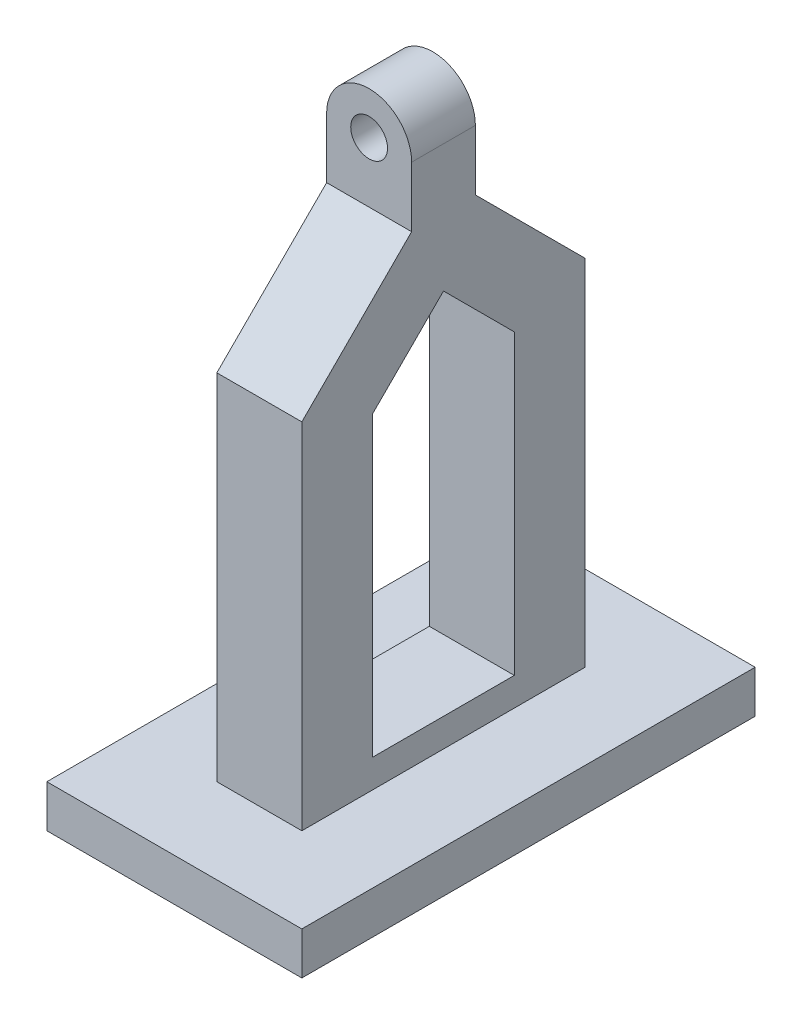
ISO-10303-21;
HEADER;
FILE_DESCRIPTION(('STEP AP214'),'2;1');
FILE_NAME('part.step','',(''),(''),'','','');
FILE_SCHEMA(('AUTOMOTIVE_DESIGN { 1 0 10303 214 1 1 1 1 }'));
ENDSEC;
DATA;
#1=APPLICATION_CONTEXT('core data for automotive mechanical design processes');
#2=APPLICATION_PROTOCOL_DEFINITION('international standard','automotive_design',2000,#1);
#3=PRODUCT_CONTEXT('',#1,'mechanical');
#4=PRODUCT('Part','Part','',(#3));
#5=PRODUCT_RELATED_PRODUCT_CATEGORY('part','',(#4));
#6=PRODUCT_DEFINITION_FORMATION('','',#4);
#7=PRODUCT_DEFINITION_CONTEXT('part definition',#1,'design');
#8=PRODUCT_DEFINITION('design','',#6,#7);
#9=PRODUCT_DEFINITION_SHAPE('','',#8);
#10=(LENGTH_UNIT() NAMED_UNIT(*) SI_UNIT(.MILLI.,.METRE.));
#11=(NAMED_UNIT(*) PLANE_ANGLE_UNIT() SI_UNIT($,.RADIAN.));
#12=(NAMED_UNIT(*) SI_UNIT($,.STERADIAN.) SOLID_ANGLE_UNIT());
#13=UNCERTAINTY_MEASURE_WITH_UNIT(LENGTH_MEASURE(1.E-05),#10,'distance_accuracy_value','');
#14=(GEOMETRIC_REPRESENTATION_CONTEXT(3) GLOBAL_UNCERTAINTY_ASSIGNED_CONTEXT((#13)) GLOBAL_UNIT_ASSIGNED_CONTEXT((#10,
#11,#12)) REPRESENTATION_CONTEXT('',''));
#15=CARTESIAN_POINT('',(0.,0.,0.));
#16=DIRECTION('',(0.,0.,1.));
#17=DIRECTION('',(1.,0.,0.));
#18=AXIS2_PLACEMENT_3D('',#15,#16,#17);
#19=CARTESIAN_POINT('',(0.,0.,2.8575));
#20=DIRECTION('',(0.,0.,-1.));
#21=DIRECTION('',(-1.,0.,0.));
#22=AXIS2_PLACEMENT_3D('',#19,#20,#21);
#23=PLANE('',#22);
#24=CARTESIAN_POINT('',(0.,50.8,2.8575));
#25=DIRECTION('',(0.,0.,-1.));
#26=DIRECTION('',(-1.,0.,0.));
#27=AXIS2_PLACEMENT_3D('',#24,#25,#26);
#28=CIRCLE('',#27,1.64999999999999);
#29=CARTESIAN_POINT('',(-1.64999999999999,50.8,2.8575));
#30=VERTEX_POINT('',#29);
#31=EDGE_CURVE('E179',#30,#30,#28,.T.);
#32=ORIENTED_EDGE('',*,*,#31,.T.);
#33=EDGE_LOOP('',(#32));
#34=FACE_BOUND('',#33,.T.);
#35=DIRECTION('',(0.,1.,0.));
#36=VECTOR('',#35,1.);
#37=CARTESIAN_POINT('',(3.81,48.26,2.8575));
#38=LINE('',#37,#36);
#39=CARTESIAN_POINT('',(3.81,45.4024999999999,2.8575));
#40=VERTEX_POINT('',#39);
#41=CARTESIAN_POINT('',(3.81,50.8,2.85750000000001));
#42=VERTEX_POINT('',#41);
#43=EDGE_CURVE('E201',#40,#42,#38,.T.);
#44=ORIENTED_EDGE('',*,*,#43,.T.);
#45=CARTESIAN_POINT('',(0.,50.8,2.85750000000001));
#46=DIRECTION('',(0.,0.,-1.));
#47=DIRECTION('',(-1.,0.,0.));
#48=AXIS2_PLACEMENT_3D('',#45,#46,#47);
#49=CIRCLE('',#48,3.81);
#50=CARTESIAN_POINT('',(-3.81,50.8,2.85750000000001));
#51=VERTEX_POINT('',#50);
#52=EDGE_CURVE('E73',#42,#51,#49,.F.);
#53=ORIENTED_EDGE('',*,*,#52,.T.);
#54=DIRECTION('',(0.,-1.,0.));
#55=VECTOR('',#54,1.);
#56=CARTESIAN_POINT('',(-3.81,48.26,2.8575));
#57=LINE('',#56,#55);
#58=CARTESIAN_POINT('',(-3.81,45.4024999999999,2.8575));
#59=VERTEX_POINT('',#58);
#60=EDGE_CURVE('E185',#51,#59,#57,.T.);
#61=ORIENTED_EDGE('',*,*,#60,.T.);
#62=DIRECTION('',(-1.,0.,0.));
#63=VECTOR('',#62,1.);
#64=CARTESIAN_POINT('',(0.,45.4024999999999,2.8575));
#65=LINE('',#64,#63);
#66=EDGE_CURVE('E59',#59,#40,#65,.F.);
#67=ORIENTED_EDGE('',*,*,#66,.T.);
#68=EDGE_LOOP('',(#44,#53,#61,#67));
#69=FACE_BOUND('',#68,.T.);
#70=ADVANCED_FACE('F49',(#34,#69),#23,.F.);
#71=CARTESIAN_POINT('',(0.,0.,-2.8575));
#72=DIRECTION('',(0.,0.,-1.));
#73=DIRECTION('',(-1.,0.,0.));
#74=AXIS2_PLACEMENT_3D('',#71,#72,#73);
#75=PLANE('',#74);
#76=CARTESIAN_POINT('',(0.,50.8,-2.8575));
#77=DIRECTION('',(0.,0.,-1.));
#78=DIRECTION('',(-1.,0.,0.));
#79=AXIS2_PLACEMENT_3D('',#76,#77,#78);
#80=CIRCLE('',#79,1.64999999999999);
#81=CARTESIAN_POINT('',(-1.64999999999999,50.8,-2.8575));
#82=VERTEX_POINT('',#81);
#83=EDGE_CURVE('E195',#82,#82,#80,.T.);
#84=ORIENTED_EDGE('',*,*,#83,.F.);
#85=EDGE_LOOP('',(#84));
#86=FACE_BOUND('',#85,.T.);
#87=CARTESIAN_POINT('',(0.,50.8,-2.85750000000001));
#88=DIRECTION('',(0.,0.,-1.));
#89=DIRECTION('',(-1.,0.,0.));
#90=AXIS2_PLACEMENT_3D('',#87,#88,#89);
#91=CIRCLE('',#90,3.81);
#92=CARTESIAN_POINT('',(3.81,50.8,-2.85750000000001));
#93=VERTEX_POINT('',#92);
#94=CARTESIAN_POINT('',(-3.81,50.8,-2.85750000000001));
#95=VERTEX_POINT('',#94);
#96=EDGE_CURVE('E12',#93,#95,#91,.F.);
#97=ORIENTED_EDGE('',*,*,#96,.F.);
#98=DIRECTION('',(0.,1.,0.));
#99=VECTOR('',#98,1.);
#100=CARTESIAN_POINT('',(3.81,48.26,-2.8575));
#101=LINE('',#100,#99);
#102=CARTESIAN_POINT('',(3.81,45.4024999999998,-2.8575));
#103=VERTEX_POINT('',#102);
#104=EDGE_CURVE('E178',#103,#93,#101,.T.);
#105=ORIENTED_EDGE('',*,*,#104,.F.);
#106=DIRECTION('',(1.,0.,0.));
#107=VECTOR('',#106,1.);
#108=CARTESIAN_POINT('',(3.81,45.4024999999998,-2.8575));
#109=LINE('',#108,#107);
#110=CARTESIAN_POINT('',(-3.81,45.4024999999998,-2.8575));
#111=VERTEX_POINT('',#110);
#112=EDGE_CURVE('E174',#103,#111,#109,.F.);
#113=ORIENTED_EDGE('',*,*,#112,.T.);
#114=DIRECTION('',(0.,-1.,0.));
#115=VECTOR('',#114,1.);
#116=CARTESIAN_POINT('',(-3.81,48.26,-2.8575));
#117=LINE('',#116,#115);
#118=EDGE_CURVE('E170',#95,#111,#117,.T.);
#119=ORIENTED_EDGE('',*,*,#118,.F.);
#120=EDGE_LOOP('',(#97,#105,#113,#119));
#121=FACE_BOUND('',#120,.T.);
#122=ADVANCED_FACE('F172',(#86,#121),#75,.T.);
#123=CARTESIAN_POINT('',(3.81,48.26,-12.7));
#124=DIRECTION('',(0.,0.,1.));
#125=DIRECTION('',(0.,-1.,0.));
#126=AXIS2_PLACEMENT_3D('',#123,#124,#125);
#127=PLANE('',#126);
#128=DIRECTION('',(0.,1.,0.));
#129=VECTOR('',#128,1.);
#130=CARTESIAN_POINT('',(-3.81,48.26,-12.7));
#131=LINE('',#130,#129);
#132=CARTESIAN_POINT('',(-3.81,3.81,-12.7));
#133=VERTEX_POINT('',#132);
#134=CARTESIAN_POINT('',(-3.81,35.5599999999999,-12.7));
#135=VERTEX_POINT('',#134);
#136=EDGE_CURVE('E287',#133,#135,#131,.T.);
#137=ORIENTED_EDGE('',*,*,#136,.T.);
#138=DIRECTION('',(1.,0.,0.));
#139=VECTOR('',#138,1.);
#140=CARTESIAN_POINT('',(3.81,35.5599999999999,-12.7));
#141=LINE('',#140,#139);
#142=CARTESIAN_POINT('',(3.81,35.5599999999999,-12.7));
#143=VERTEX_POINT('',#142);
#144=EDGE_CURVE('E339',#135,#143,#141,.T.);
#145=ORIENTED_EDGE('',*,*,#144,.T.);
#146=DIRECTION('',(0.,1.,0.));
#147=VECTOR('',#146,1.);
#148=CARTESIAN_POINT('',(3.81,48.26,-12.7));
#149=LINE('',#148,#147);
#150=CARTESIAN_POINT('',(3.81,3.81,-12.7));
#151=VERTEX_POINT('',#150);
#152=EDGE_CURVE('E291',#151,#143,#149,.T.);
#153=ORIENTED_EDGE('',*,*,#152,.F.);
#154=DIRECTION('',(-1.,0.,0.));
#155=VECTOR('',#154,1.);
#156=CARTESIAN_POINT('',(3.81,3.81,-12.7));
#157=LINE('',#156,#155);
#158=EDGE_CURVE('E253',#151,#133,#157,.T.);
#159=ORIENTED_EDGE('',*,*,#158,.T.);
#160=EDGE_LOOP('',(#137,#145,#153,#159));
#161=FACE_BOUND('',#160,.T.);
#162=ADVANCED_FACE('F375',(#161),#127,.F.);
#163=CARTESIAN_POINT('',(3.81,48.26,12.7));
#164=DIRECTION('',(0.,0.,-1.));
#165=DIRECTION('',(0.,1.,0.));
#166=AXIS2_PLACEMENT_3D('',#163,#164,#165);
#167=PLANE('',#166);
#168=DIRECTION('',(0.,-1.,0.));
#169=VECTOR('',#168,1.);
#170=CARTESIAN_POINT('',(3.81,48.26,12.7));
#171=LINE('',#170,#169);
#172=CARTESIAN_POINT('',(3.81,35.5599999999998,12.7));
#173=VERTEX_POINT('',#172);
#174=CARTESIAN_POINT('',(3.81,3.81,12.7));
#175=VERTEX_POINT('',#174);
#176=EDGE_CURVE('E295',#173,#175,#171,.T.);
#177=ORIENTED_EDGE('',*,*,#176,.F.);
#178=DIRECTION('',(-1.,0.,0.));
#179=VECTOR('',#178,1.);
#180=CARTESIAN_POINT('',(3.81,35.5599999999998,12.7));
#181=LINE('',#180,#179);
#182=CARTESIAN_POINT('',(-3.81,35.5599999999998,12.7));
#183=VERTEX_POINT('',#182);
#184=EDGE_CURVE('E350',#173,#183,#181,.T.);
#185=ORIENTED_EDGE('',*,*,#184,.T.);
#186=DIRECTION('',(0.,-1.,0.));
#187=VECTOR('',#186,1.);
#188=CARTESIAN_POINT('',(-3.81,48.26,12.7));
#189=LINE('',#188,#187);
#190=CARTESIAN_POINT('',(-3.81,3.81,12.7));
#191=VERTEX_POINT('',#190);
#192=EDGE_CURVE('E296',#183,#191,#189,.T.);
#193=ORIENTED_EDGE('',*,*,#192,.T.);
#194=DIRECTION('',(1.,0.,0.));
#195=VECTOR('',#194,1.);
#196=CARTESIAN_POINT('',(3.81,3.81,12.7));
#197=LINE('',#196,#195);
#198=EDGE_CURVE('E249',#191,#175,#197,.T.);
#199=ORIENTED_EDGE('',*,*,#198,.T.);
#200=EDGE_LOOP('',(#177,#185,#193,#199));
#201=FACE_BOUND('',#200,.T.);
#202=ADVANCED_FACE('F366',(#201),#167,.F.);
#203=CARTESIAN_POINT('',(3.81,0.,0.));
#204=DIRECTION('',(1.,0.,0.));
#205=DIRECTION('',(0.,0.,-1.));
#206=AXIS2_PLACEMENT_3D('',#203,#204,#205);
#207=PLANE('',#206);
#208=DIRECTION('',(0.,0.,-1.));
#209=VECTOR('',#208,1.);
#210=CARTESIAN_POINT('',(3.81,50.8,134.210456389493));
#211=LINE('',#210,#209);
#212=EDGE_CURVE('E66',#42,#93,#211,.T.);
#213=ORIENTED_EDGE('',*,*,#212,.F.);
#214=ORIENTED_EDGE('',*,*,#43,.F.);
#215=DIRECTION('',(0.,0.707106781186551,-0.707106781186544));
#216=VECTOR('',#215,1.);
#217=CARTESIAN_POINT('',(3.81,24.1299999999997,24.13));
#218=LINE('',#217,#216);
#219=EDGE_CURVE('E343',#40,#173,#218,.F.);
#220=ORIENTED_EDGE('',*,*,#219,.T.);
#221=ORIENTED_EDGE('',*,*,#176,.T.);
#222=DIRECTION('',(0.,0.,1.));
#223=VECTOR('',#222,1.);
#224=CARTESIAN_POINT('',(3.81,3.81,0.));
#225=LINE('',#224,#223);
#226=EDGE_CURVE('E257',#151,#175,#225,.T.);
#227=ORIENTED_EDGE('',*,*,#226,.F.);
#228=ORIENTED_EDGE('',*,*,#152,.T.);
#229=DIRECTION('',(0.,-0.707106781186544,-0.707106781186551));
#230=VECTOR('',#229,1.);
#231=CARTESIAN_POINT('',(3.81,24.1300000000001,-24.1299999999999));
#232=LINE('',#231,#230);
#233=EDGE_CURVE('E346',#143,#103,#232,.F.);
#234=ORIENTED_EDGE('',*,*,#233,.T.);
#235=ORIENTED_EDGE('',*,*,#104,.T.);
#236=EDGE_LOOP('',(#213,#214,#220,#221,#227,#228,#234,#235));
#237=FACE_BOUND('',#236,.T.);
#238=DIRECTION('',(0.,0.,-1.));
#239=VECTOR('',#238,1.);
#240=CARTESIAN_POINT('',(3.81,6.35,6.35));
#241=LINE('',#240,#239);
#242=CARTESIAN_POINT('',(3.81,6.35,6.35));
#243=VERTEX_POINT('',#242);
#244=CARTESIAN_POINT('',(3.81,6.35,-6.35));
#245=VERTEX_POINT('',#244);
#246=EDGE_CURVE('E261',#243,#245,#241,.T.);
#247=ORIENTED_EDGE('',*,*,#246,.F.);
#248=DIRECTION('',(0.,-1.,0.));
#249=VECTOR('',#248,1.);
#250=CARTESIAN_POINT('',(3.81,39.37,6.35000000000001));
#251=LINE('',#250,#249);
#252=CARTESIAN_POINT('',(3.81,33.02,6.35000000000001));
#253=VERTEX_POINT('',#252);
#254=EDGE_CURVE('E267',#253,#243,#251,.T.);
#255=ORIENTED_EDGE('',*,*,#254,.F.);
#256=DIRECTION('',(0.,-0.707106781186551,0.707106781186544));
#257=VECTOR('',#256,1.);
#258=CARTESIAN_POINT('',(3.81,33.02,6.35000000000001));
#259=LINE('',#258,#257);
#260=CARTESIAN_POINT('',(3.81,39.37,0.));
#261=VERTEX_POINT('',#260);
#262=EDGE_CURVE('E315',#253,#261,#259,.F.);
#263=ORIENTED_EDGE('',*,*,#262,.T.);
#264=DIRECTION('',(0.,0.707106781186544,0.707106781186551));
#265=VECTOR('',#264,1.);
#266=CARTESIAN_POINT('',(3.81,39.37,0.));
#267=LINE('',#266,#265);
#268=CARTESIAN_POINT('',(3.81,33.02,-6.34999999999999));
#269=VERTEX_POINT('',#268);
#270=EDGE_CURVE('E321',#261,#269,#267,.F.);
#271=ORIENTED_EDGE('',*,*,#270,.T.);
#272=DIRECTION('',(0.,1.,0.));
#273=VECTOR('',#272,1.);
#274=CARTESIAN_POINT('',(3.81,6.35,-6.35));
#275=LINE('',#274,#273);
#276=EDGE_CURVE('E277',#245,#269,#275,.T.);
#277=ORIENTED_EDGE('',*,*,#276,.F.);
#278=EDGE_LOOP('',(#247,#255,#263,#271,#277));
#279=FACE_BOUND('',#278,.T.);
#280=ADVANCED_FACE('F362',(#237,#279),#207,.T.);
#281=CARTESIAN_POINT('',(-3.81,0.,0.));
#282=DIRECTION('',(1.,0.,0.));
#283=DIRECTION('',(0.,0.,-1.));
#284=AXIS2_PLACEMENT_3D('',#281,#282,#283);
#285=PLANE('',#284);
#286=DIRECTION('',(0.,1.,0.));
#287=VECTOR('',#286,1.);
#288=CARTESIAN_POINT('',(-3.81,6.35,-6.35));
#289=LINE('',#288,#287);
#290=CARTESIAN_POINT('',(-3.81,6.35,-6.35));
#291=VERTEX_POINT('',#290);
#292=CARTESIAN_POINT('',(-3.81,33.02,-6.34999999999999));
#293=VERTEX_POINT('',#292);
#294=EDGE_CURVE('E266',#291,#293,#289,.T.);
#295=ORIENTED_EDGE('',*,*,#294,.T.);
#296=DIRECTION('',(0.,-0.707106781186544,-0.707106781186551));
#297=VECTOR('',#296,1.);
#298=CARTESIAN_POINT('',(-3.81,19.6850000000002,-19.685));
#299=LINE('',#298,#297);
#300=CARTESIAN_POINT('',(-3.81,39.37,0.));
#301=VERTEX_POINT('',#300);
#302=EDGE_CURVE('E324',#293,#301,#299,.F.);
#303=ORIENTED_EDGE('',*,*,#302,.T.);
#304=DIRECTION('',(0.,0.707106781186551,-0.707106781186544));
#305=VECTOR('',#304,1.);
#306=CARTESIAN_POINT('',(-3.81,19.6849999999998,19.685));
#307=LINE('',#306,#305);
#308=CARTESIAN_POINT('',(-3.81,33.02,6.35000000000001));
#309=VERTEX_POINT('',#308);
#310=EDGE_CURVE('E318',#301,#309,#307,.F.);
#311=ORIENTED_EDGE('',*,*,#310,.T.);
#312=DIRECTION('',(0.,-1.,0.));
#313=VECTOR('',#312,1.);
#314=CARTESIAN_POINT('',(-3.81,39.37,6.35000000000001));
#315=LINE('',#314,#313);
#316=CARTESIAN_POINT('',(-3.81,6.35,6.35));
#317=VERTEX_POINT('',#316);
#318=EDGE_CURVE('E271',#309,#317,#315,.T.);
#319=ORIENTED_EDGE('',*,*,#318,.T.);
#320=DIRECTION('',(0.,0.,-1.));
#321=VECTOR('',#320,1.);
#322=CARTESIAN_POINT('',(-3.81,6.35,6.35));
#323=LINE('',#322,#321);
#324=EDGE_CURVE('E262',#317,#291,#323,.T.);
#325=ORIENTED_EDGE('',*,*,#324,.T.);
#326=EDGE_LOOP('',(#295,#303,#311,#319,#325));
#327=FACE_BOUND('',#326,.T.);
#328=ORIENTED_EDGE('',*,*,#60,.F.);
#329=DIRECTION('',(0.,0.,-1.));
#330=VECTOR('',#329,1.);
#331=CARTESIAN_POINT('',(-3.81,50.8,134.210456389493));
#332=LINE('',#331,#330);
#333=EDGE_CURVE('E182',#51,#95,#332,.T.);
#334=ORIENTED_EDGE('',*,*,#333,.T.);
#335=ORIENTED_EDGE('',*,*,#118,.T.);
#336=DIRECTION('',(0.,0.707106781186544,0.707106781186551));
#337=VECTOR('',#336,1.);
#338=CARTESIAN_POINT('',(-3.81,48.26,2.34187669256869E-13));
#339=LINE('',#338,#337);
#340=EDGE_CURVE('E336',#111,#135,#339,.F.);
#341=ORIENTED_EDGE('',*,*,#340,.T.);
#342=ORIENTED_EDGE('',*,*,#136,.F.);
#343=DIRECTION('',(0.,0.,1.));
#344=VECTOR('',#343,1.);
#345=CARTESIAN_POINT('',(-3.81,3.81,0.));
#346=LINE('',#345,#344);
#347=EDGE_CURVE('E299',#133,#191,#346,.T.);
#348=ORIENTED_EDGE('',*,*,#347,.T.);
#349=ORIENTED_EDGE('',*,*,#192,.F.);
#350=DIRECTION('',(0.,-0.707106781186551,0.707106781186544));
#351=VECTOR('',#350,1.);
#352=CARTESIAN_POINT('',(-3.81,35.5599999999998,12.7));
#353=LINE('',#352,#351);
#354=EDGE_CURVE('E327',#183,#59,#353,.F.);
#355=ORIENTED_EDGE('',*,*,#354,.T.);
#356=EDGE_LOOP('',(#328,#334,#335,#341,#342,#348,#349,#355));
#357=FACE_BOUND('',#356,.T.);
#358=ADVANCED_FACE('F183',(#327,#357),#285,.F.);
#359=CARTESIAN_POINT('',(-3.81,6.35,6.35));
#360=DIRECTION('',(0.,-1.,0.));
#361=DIRECTION('',(0.,0.,-1.));
#362=AXIS2_PLACEMENT_3D('',#359,#360,#361);
#363=PLANE('',#362);
#364=ORIENTED_EDGE('',*,*,#246,.T.);
#365=DIRECTION('',(1.,0.,0.));
#366=VECTOR('',#365,1.);
#367=CARTESIAN_POINT('',(-3.81,6.35,-6.35));
#368=LINE('',#367,#366);
#369=EDGE_CURVE('E274',#291,#245,#368,.T.);
#370=ORIENTED_EDGE('',*,*,#369,.F.);
#371=ORIENTED_EDGE('',*,*,#324,.F.);
#372=DIRECTION('',(1.,0.,0.));
#373=VECTOR('',#372,1.);
#374=CARTESIAN_POINT('',(-3.81,6.35,6.35));
#375=LINE('',#374,#373);
#376=EDGE_CURVE('E283',#317,#243,#375,.T.);
#377=ORIENTED_EDGE('',*,*,#376,.T.);
#378=EDGE_LOOP('',(#364,#370,#371,#377));
#379=FACE_BOUND('',#378,.T.);
#380=ADVANCED_FACE('F424',(#379),#363,.F.);
#381=CARTESIAN_POINT('',(-3.81,39.37,6.35000000000001));
#382=DIRECTION('',(0.,0.,1.));
#383=DIRECTION('',(0.,-1.,0.));
#384=AXIS2_PLACEMENT_3D('',#381,#382,#383);
#385=PLANE('',#384);
#386=ORIENTED_EDGE('',*,*,#318,.F.);
#387=DIRECTION('',(1.,0.,0.));
#388=VECTOR('',#387,1.);
#389=CARTESIAN_POINT('',(3.81,33.02,6.35000000000001));
#390=LINE('',#389,#388);
#391=EDGE_CURVE('E308',#309,#253,#390,.T.);
#392=ORIENTED_EDGE('',*,*,#391,.T.);
#393=ORIENTED_EDGE('',*,*,#254,.T.);
#394=ORIENTED_EDGE('',*,*,#376,.F.);
#395=EDGE_LOOP('',(#386,#392,#393,#394));
#396=FACE_BOUND('',#395,.T.);
#397=ADVANCED_FACE('F421',(#396),#385,.F.);
#398=CARTESIAN_POINT('',(-3.81,6.35,-6.35));
#399=DIRECTION('',(0.,0.,-1.));
#400=DIRECTION('',(0.,1.,0.));
#401=AXIS2_PLACEMENT_3D('',#398,#399,#400);
#402=PLANE('',#401);
#403=ORIENTED_EDGE('',*,*,#276,.T.);
#404=DIRECTION('',(-1.,0.,0.));
#405=VECTOR('',#404,1.);
#406=CARTESIAN_POINT('',(-3.81,33.02,-6.34999999999999));
#407=LINE('',#406,#405);
#408=EDGE_CURVE('E312',#269,#293,#407,.T.);
#409=ORIENTED_EDGE('',*,*,#408,.T.);
#410=ORIENTED_EDGE('',*,*,#294,.F.);
#411=ORIENTED_EDGE('',*,*,#369,.T.);
#412=EDGE_LOOP('',(#403,#409,#410,#411));
#413=FACE_BOUND('',#412,.T.);
#414=ADVANCED_FACE('F419',(#413),#402,.F.);
#415=CARTESIAN_POINT('',(11.43,3.81,-20.32));
#416=DIRECTION('',(0.,0.,1.));
#417=DIRECTION('',(1.,0.,0.));
#418=AXIS2_PLACEMENT_3D('',#415,#416,#417);
#419=PLANE('',#418);
#420=DIRECTION('',(-1.,0.,0.));
#421=VECTOR('',#420,1.);
#422=CARTESIAN_POINT('',(11.43,0.,-20.32));
#423=LINE('',#422,#421);
#424=CARTESIAN_POINT('',(11.43,0.,-20.32));
#425=VERTEX_POINT('',#424);
#426=CARTESIAN_POINT('',(-11.43,0.,-20.32));
#427=VERTEX_POINT('',#426);
#428=EDGE_CURVE('E222',#425,#427,#423,.T.);
#429=ORIENTED_EDGE('',*,*,#428,.T.);
#430=DIRECTION('',(0.,-1.,0.));
#431=VECTOR('',#430,1.);
#432=CARTESIAN_POINT('',(-11.43,3.81,-20.32));
#433=LINE('',#432,#431);
#434=CARTESIAN_POINT('',(-11.43,3.81,-20.32));
#435=VERTEX_POINT('',#434);
#436=EDGE_CURVE('E245',#435,#427,#433,.T.);
#437=ORIENTED_EDGE('',*,*,#436,.F.);
#438=DIRECTION('',(-1.,0.,0.));
#439=VECTOR('',#438,1.);
#440=CARTESIAN_POINT('',(11.43,3.81,-20.32));
#441=LINE('',#440,#439);
#442=CARTESIAN_POINT('',(11.43,3.81,-20.32));
#443=VERTEX_POINT('',#442);
#444=EDGE_CURVE('E207',#443,#435,#441,.T.);
#445=ORIENTED_EDGE('',*,*,#444,.F.);
#446=DIRECTION('',(0.,-1.,0.));
#447=VECTOR('',#446,1.);
#448=CARTESIAN_POINT('',(11.43,3.81,-20.32));
#449=LINE('',#448,#447);
#450=EDGE_CURVE('E221',#443,#425,#449,.T.);
#451=ORIENTED_EDGE('',*,*,#450,.T.);
#452=EDGE_LOOP('',(#429,#437,#445,#451));
#453=FACE_BOUND('',#452,.T.);
#454=ADVANCED_FACE('F415',(#453),#419,.F.);
#455=CARTESIAN_POINT('',(-11.43,3.81,-20.32));
#456=DIRECTION('',(1.,0.,0.));
#457=DIRECTION('',(0.,0.,-1.));
#458=AXIS2_PLACEMENT_3D('',#455,#456,#457);
#459=PLANE('',#458);
#460=DIRECTION('',(0.,0.,1.));
#461=VECTOR('',#460,1.);
#462=CARTESIAN_POINT('',(-11.43,0.,-20.32));
#463=LINE('',#462,#461);
#464=CARTESIAN_POINT('',(-11.43,0.,20.32));
#465=VERTEX_POINT('',#464);
#466=EDGE_CURVE('E226',#427,#465,#463,.T.);
#467=ORIENTED_EDGE('',*,*,#466,.T.);
#468=DIRECTION('',(0.,-1.,0.));
#469=VECTOR('',#468,1.);
#470=CARTESIAN_POINT('',(-11.43,3.81,20.32));
#471=LINE('',#470,#469);
#472=CARTESIAN_POINT('',(-11.43,3.81,20.32));
#473=VERTEX_POINT('',#472);
#474=EDGE_CURVE('E241',#473,#465,#471,.T.);
#475=ORIENTED_EDGE('',*,*,#474,.F.);
#476=DIRECTION('',(0.,0.,1.));
#477=VECTOR('',#476,1.);
#478=CARTESIAN_POINT('',(-11.43,3.81,-20.32));
#479=LINE('',#478,#477);
#480=EDGE_CURVE('E211',#435,#473,#479,.T.);
#481=ORIENTED_EDGE('',*,*,#480,.F.);
#482=ORIENTED_EDGE('',*,*,#436,.T.);
#483=EDGE_LOOP('',(#467,#475,#481,#482));
#484=FACE_BOUND('',#483,.T.);
#485=ADVANCED_FACE('F411',(#484),#459,.F.);
#486=CARTESIAN_POINT('',(-11.43,3.81,20.32));
#487=DIRECTION('',(0.,0.,-1.));
#488=DIRECTION('',(-1.,0.,0.));
#489=AXIS2_PLACEMENT_3D('',#486,#487,#488);
#490=PLANE('',#489);
#491=DIRECTION('',(1.,0.,0.));
#492=VECTOR('',#491,1.);
#493=CARTESIAN_POINT('',(-11.43,0.,20.32));
#494=LINE('',#493,#492);
#495=CARTESIAN_POINT('',(11.43,0.,20.32));
#496=VERTEX_POINT('',#495);
#497=EDGE_CURVE('E229',#465,#496,#494,.T.);
#498=ORIENTED_EDGE('',*,*,#497,.T.);
#499=DIRECTION('',(0.,-1.,0.));
#500=VECTOR('',#499,1.);
#501=CARTESIAN_POINT('',(11.43,3.81,20.32));
#502=LINE('',#501,#500);
#503=CARTESIAN_POINT('',(11.43,3.81,20.32));
#504=VERTEX_POINT('',#503);
#505=EDGE_CURVE('E237',#504,#496,#502,.T.);
#506=ORIENTED_EDGE('',*,*,#505,.F.);
#507=DIRECTION('',(1.,0.,0.));
#508=VECTOR('',#507,1.);
#509=CARTESIAN_POINT('',(-11.43,3.81,20.32));
#510=LINE('',#509,#508);
#511=EDGE_CURVE('E215',#473,#504,#510,.T.);
#512=ORIENTED_EDGE('',*,*,#511,.F.);
#513=ORIENTED_EDGE('',*,*,#474,.T.);
#514=EDGE_LOOP('',(#498,#506,#512,#513));
#515=FACE_BOUND('',#514,.T.);
#516=ADVANCED_FACE('F407',(#515),#490,.F.);
#517=CARTESIAN_POINT('',(11.43,3.81,20.32));
#518=DIRECTION('',(-1.,0.,0.));
#519=DIRECTION('',(0.,0.,1.));
#520=AXIS2_PLACEMENT_3D('',#517,#518,#519);
#521=PLANE('',#520);
#522=DIRECTION('',(0.,0.,-1.));
#523=VECTOR('',#522,1.);
#524=CARTESIAN_POINT('',(11.43,0.,20.32));
#525=LINE('',#524,#523);
#526=EDGE_CURVE('E212',#496,#425,#525,.T.);
#527=ORIENTED_EDGE('',*,*,#526,.T.);
#528=ORIENTED_EDGE('',*,*,#450,.F.);
#529=DIRECTION('',(0.,0.,-1.));
#530=VECTOR('',#529,1.);
#531=CARTESIAN_POINT('',(11.43,3.81,20.32));
#532=LINE('',#531,#530);
#533=EDGE_CURVE('E218',#504,#443,#532,.T.);
#534=ORIENTED_EDGE('',*,*,#533,.F.);
#535=ORIENTED_EDGE('',*,*,#505,.T.);
#536=EDGE_LOOP('',(#527,#528,#534,#535));
#537=FACE_BOUND('',#536,.T.);
#538=ADVANCED_FACE('F404',(#537),#521,.F.);
#539=CARTESIAN_POINT('',(0.,3.81,0.));
#540=DIRECTION('',(0.,1.,0.));
#541=DIRECTION('',(0.,0.,1.));
#542=AXIS2_PLACEMENT_3D('',#539,#540,#541);
#543=PLANE('',#542);
#544=ORIENTED_EDGE('',*,*,#158,.F.);
#545=ORIENTED_EDGE('',*,*,#226,.T.);
#546=ORIENTED_EDGE('',*,*,#198,.F.);
#547=ORIENTED_EDGE('',*,*,#347,.F.);
#548=EDGE_LOOP('',(#544,#545,#546,#547));
#549=FACE_BOUND('',#548,.T.);
#550=ORIENTED_EDGE('',*,*,#444,.T.);
#551=ORIENTED_EDGE('',*,*,#480,.T.);
#552=ORIENTED_EDGE('',*,*,#511,.T.);
#553=ORIENTED_EDGE('',*,*,#533,.T.);
#554=EDGE_LOOP('',(#550,#551,#552,#553));
#555=FACE_BOUND('',#554,.T.);
#556=ADVANCED_FACE('F370',(#549,#555),#543,.T.);
#557=CARTESIAN_POINT('',(3.81,0.,12.7));
#558=DIRECTION('',(0.,1.,0.));
#559=DIRECTION('',(0.,0.,1.));
#560=AXIS2_PLACEMENT_3D('',#557,#558,#559);
#561=PLANE('',#560);
#562=ORIENTED_EDGE('',*,*,#428,.F.);
#563=ORIENTED_EDGE('',*,*,#526,.F.);
#564=ORIENTED_EDGE('',*,*,#497,.F.);
#565=ORIENTED_EDGE('',*,*,#466,.F.);
#566=EDGE_LOOP('',(#562,#563,#564,#565));
#567=FACE_BOUND('',#566,.T.);
#568=ADVANCED_FACE('F403',(#567),#561,.F.);
#569=CARTESIAN_POINT('',(-3.81,39.37,0.));
#570=DIRECTION('',(0.,-0.707106781186551,0.707106781186544));
#571=DIRECTION('',(-1.,0.,0.));
#572=AXIS2_PLACEMENT_3D('',#569,#570,#571);
#573=PLANE('',#572);
#574=DIRECTION('',(1.,0.,0.));
#575=VECTOR('',#574,1.);
#576=CARTESIAN_POINT('',(3.81,39.37,0.));
#577=LINE('',#576,#575);
#578=EDGE_CURVE('E203',#301,#261,#577,.T.);
#579=ORIENTED_EDGE('',*,*,#578,.F.);
#580=ORIENTED_EDGE('',*,*,#302,.F.);
#581=ORIENTED_EDGE('',*,*,#408,.F.);
#582=ORIENTED_EDGE('',*,*,#270,.F.);
#583=EDGE_LOOP('',(#579,#580,#581,#582));
#584=FACE_BOUND('',#583,.T.);
#585=ADVANCED_FACE('F439',(#584),#573,.T.);
#586=CARTESIAN_POINT('',(-3.81,33.02,6.35000000000001));
#587=DIRECTION('',(0.,-0.707106781186544,-0.707106781186551));
#588=DIRECTION('',(-1.,0.,0.));
#589=AXIS2_PLACEMENT_3D('',#586,#587,#588);
#590=PLANE('',#589);
#591=ORIENTED_EDGE('',*,*,#310,.F.);
#592=ORIENTED_EDGE('',*,*,#578,.T.);
#593=ORIENTED_EDGE('',*,*,#262,.F.);
#594=ORIENTED_EDGE('',*,*,#391,.F.);
#595=EDGE_LOOP('',(#591,#592,#593,#594));
#596=FACE_BOUND('',#595,.T.);
#597=ADVANCED_FACE('F386',(#596),#590,.T.);
#598=CARTESIAN_POINT('',(0.,50.8,-12.7));
#599=DIRECTION('',(0.,0.,-1.));
#600=DIRECTION('',(0.,1.,0.));
#601=AXIS2_PLACEMENT_3D('',#598,#599,#600);
#602=CYLINDRICAL_SURFACE('',#601,1.64999999999999);
#603=ORIENTED_EDGE('',*,*,#83,.T.);
#604=EDGE_LOOP('',(#603));
#605=FACE_BOUND('',#604,.T.);
#606=ORIENTED_EDGE('',*,*,#31,.F.);
#607=EDGE_LOOP('',(#606));
#608=FACE_BOUND('',#607,.T.);
#609=ADVANCED_FACE('F380',(#605,#608),#602,.F.);
#610=CARTESIAN_POINT('',(3.81,48.26,2.34187669256869E-13));
#611=DIRECTION('',(0.,-0.707106781186551,0.707106781186544));
#612=DIRECTION('',(-1.,0.,0.));
#613=AXIS2_PLACEMENT_3D('',#610,#611,#612);
#614=PLANE('',#613);
#615=ORIENTED_EDGE('',*,*,#233,.F.);
#616=ORIENTED_EDGE('',*,*,#144,.F.);
#617=ORIENTED_EDGE('',*,*,#340,.F.);
#618=ORIENTED_EDGE('',*,*,#112,.F.);
#619=EDGE_LOOP('',(#615,#616,#617,#618));
#620=FACE_BOUND('',#619,.T.);
#621=ADVANCED_FACE('F378',(#620),#614,.F.);
#622=CARTESIAN_POINT('',(3.81,35.5599999999998,12.7));
#623=DIRECTION('',(0.,-0.707106781186544,-0.707106781186551));
#624=DIRECTION('',(-1.,0.,0.));
#625=AXIS2_PLACEMENT_3D('',#622,#623,#624);
#626=PLANE('',#625);
#627=ORIENTED_EDGE('',*,*,#219,.F.);
#628=ORIENTED_EDGE('',*,*,#66,.F.);
#629=ORIENTED_EDGE('',*,*,#354,.F.);
#630=ORIENTED_EDGE('',*,*,#184,.F.);
#631=EDGE_LOOP('',(#627,#628,#629,#630));
#632=FACE_BOUND('',#631,.T.);
#633=ADVANCED_FACE('F52',(#632),#626,.F.);
#634=CARTESIAN_POINT('',(0.,50.8,134.210456389493));
#635=DIRECTION('',(0.,0.,-1.));
#636=DIRECTION('',(-1.,0.,0.));
#637=AXIS2_PLACEMENT_3D('',#634,#635,#636);
#638=CYLINDRICAL_SURFACE('',#637,3.81);
#639=ORIENTED_EDGE('',*,*,#333,.F.);
#640=ORIENTED_EDGE('',*,*,#52,.F.);
#641=ORIENTED_EDGE('',*,*,#212,.T.);
#642=ORIENTED_EDGE('',*,*,#96,.T.);
#643=EDGE_LOOP('',(#639,#640,#641,#642));
#644=FACE_BOUND('',#643,.T.);
#645=ADVANCED_FACE('F189',(#644),#638,.T.);
#646=CLOSED_SHELL('',(#70,#122,#162,#202,#280,#358,#380,#397,#414,#454,#485,#516,#538,#556,#568,
#585,#597,#609,#621,#633,#645));
#647=MANIFOLD_SOLID_BREP('B2',#646);
#648=ADVANCED_BREP_SHAPE_REPRESENTATION('',(#18,#647),#14);
#649=SHAPE_DEFINITION_REPRESENTATION(#9,#648);
ENDSEC;
END-ISO-10303-21;
